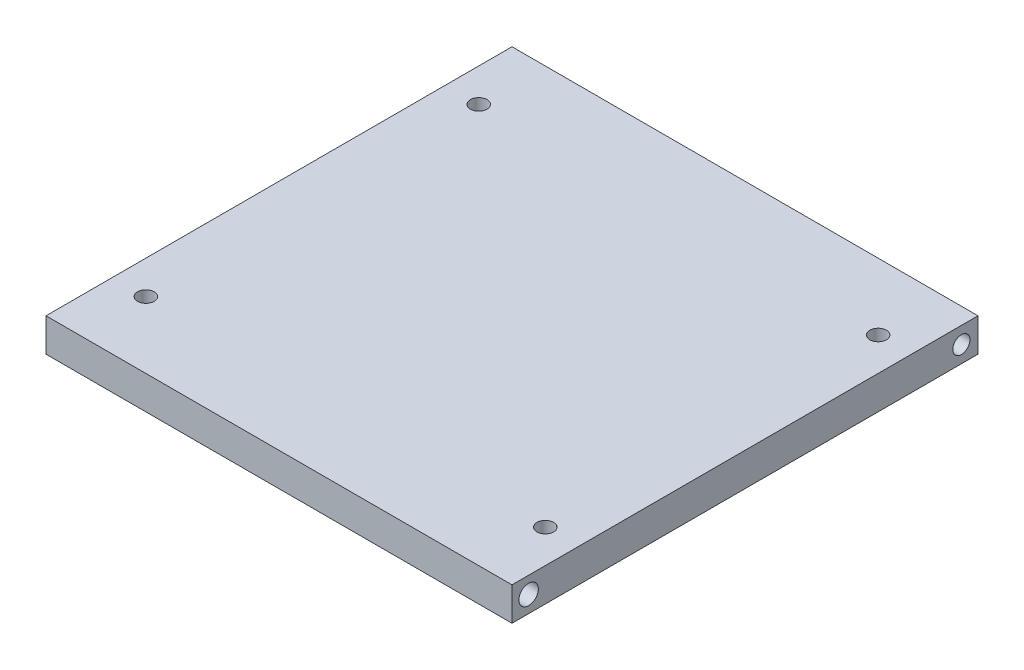
ISO-10303-21;
HEADER;
FILE_DESCRIPTION(('STEP AP214'),'2;1');
FILE_NAME('part.step','',(''),(''),'','','');
FILE_SCHEMA(('AUTOMOTIVE_DESIGN { 1 0 10303 214 1 1 1 1 }'));
ENDSEC;
DATA;
#1=APPLICATION_CONTEXT('core data for automotive mechanical design processes');
#2=APPLICATION_PROTOCOL_DEFINITION('international standard','automotive_design',2000,#1);
#3=PRODUCT_CONTEXT('',#1,'mechanical');
#4=PRODUCT('Part','Part','',(#3));
#5=PRODUCT_RELATED_PRODUCT_CATEGORY('part','',(#4));
#6=PRODUCT_DEFINITION_FORMATION('','',#4);
#7=PRODUCT_DEFINITION_CONTEXT('part definition',#1,'design');
#8=PRODUCT_DEFINITION('design','',#6,#7);
#9=PRODUCT_DEFINITION_SHAPE('','',#8);
#10=(LENGTH_UNIT() NAMED_UNIT(*) SI_UNIT(.MILLI.,.METRE.));
#11=(NAMED_UNIT(*) PLANE_ANGLE_UNIT() SI_UNIT($,.RADIAN.));
#12=(NAMED_UNIT(*) SI_UNIT($,.STERADIAN.) SOLID_ANGLE_UNIT());
#13=UNCERTAINTY_MEASURE_WITH_UNIT(LENGTH_MEASURE(1.E-05),#10,'distance_accuracy_value','');
#14=(GEOMETRIC_REPRESENTATION_CONTEXT(3) GLOBAL_UNCERTAINTY_ASSIGNED_CONTEXT((#13)) GLOBAL_UNIT_ASSIGNED_CONTEXT((#10,
#11,#12)) REPRESENTATION_CONTEXT('',''));
#15=CARTESIAN_POINT('',(0.,0.,0.));
#16=DIRECTION('',(0.,0.,1.));
#17=DIRECTION('',(1.,0.,0.));
#18=AXIS2_PLACEMENT_3D('',#15,#16,#17);
#19=CARTESIAN_POINT('',(78.,0.,-12.));
#20=DIRECTION('',(0.,1.,0.));
#21=DIRECTION('',(0.,0.,1.));
#22=AXIS2_PLACEMENT_3D('',#19,#20,#21);
#23=CYLINDRICAL_SURFACE('',#22,1.5);
#24=CARTESIAN_POINT('',(78.,0.,-12.));
#25=DIRECTION('',(0.,1.,0.));
#26=DIRECTION('',(0.,0.,1.));
#27=AXIS2_PLACEMENT_3D('',#24,#25,#26);
#28=CIRCLE('',#27,1.5);
#29=CARTESIAN_POINT('',(78.,0.,-10.5));
#30=VERTEX_POINT('',#29);
#31=EDGE_CURVE('E41',#30,#30,#28,.T.);
#32=ORIENTED_EDGE('',*,*,#31,.F.);
#33=EDGE_LOOP('',(#32));
#34=FACE_BOUND('',#33,.T.);
#35=CARTESIAN_POINT('',(78.,6.,-12.));
#36=DIRECTION('',(0.,1.,0.));
#37=DIRECTION('',(0.,0.,1.));
#38=AXIS2_PLACEMENT_3D('',#35,#36,#37);
#39=CIRCLE('',#38,1.5);
#40=CARTESIAN_POINT('',(78.,6.,-10.5));
#41=VERTEX_POINT('',#40);
#42=EDGE_CURVE('E11',#41,#41,#39,.T.);
#43=ORIENTED_EDGE('',*,*,#42,.T.);
#44=EDGE_LOOP('',(#43));
#45=FACE_BOUND('',#44,.T.);
#46=ADVANCED_FACE('F33',(#34,#45),#23,.F.);
#47=CARTESIAN_POINT('',(6.00000000000001,0.,-12.));
#48=DIRECTION('',(0.,1.,0.));
#49=DIRECTION('',(0.,0.,1.));
#50=AXIS2_PLACEMENT_3D('',#47,#48,#49);
#51=CYLINDRICAL_SURFACE('',#50,1.5);
#52=CARTESIAN_POINT('',(6.00000000000001,0.,-12.));
#53=DIRECTION('',(0.,1.,0.));
#54=DIRECTION('',(0.,0.,1.));
#55=AXIS2_PLACEMENT_3D('',#52,#53,#54);
#56=CIRCLE('',#55,1.5);
#57=CARTESIAN_POINT('',(6.00000000000001,0.,-10.5));
#58=VERTEX_POINT('',#57);
#59=EDGE_CURVE('E111',#58,#58,#56,.T.);
#60=ORIENTED_EDGE('',*,*,#59,.F.);
#61=EDGE_LOOP('',(#60));
#62=FACE_BOUND('',#61,.T.);
#63=CARTESIAN_POINT('',(6.00000000000001,6.,-12.));
#64=DIRECTION('',(0.,1.,0.));
#65=DIRECTION('',(0.,0.,1.));
#66=AXIS2_PLACEMENT_3D('',#63,#64,#65);
#67=CIRCLE('',#66,1.5);
#68=CARTESIAN_POINT('',(6.00000000000001,6.,-10.5));
#69=VERTEX_POINT('',#68);
#70=EDGE_CURVE('E114',#69,#69,#67,.T.);
#71=ORIENTED_EDGE('',*,*,#70,.T.);
#72=EDGE_LOOP('',(#71));
#73=FACE_BOUND('',#72,.T.);
#74=ADVANCED_FACE('F123',(#62,#73),#51,.F.);
#75=CARTESIAN_POINT('',(0.,6.,0.));
#76=DIRECTION('',(1.,0.,0.));
#77=DIRECTION('',(0.,0.,-1.));
#78=AXIS2_PLACEMENT_3D('',#75,#76,#77);
#79=PLANE('',#78);
#80=CARTESIAN_POINT('',(0.,3.,-81.));
#81=DIRECTION('',(-1.,0.,0.));
#82=DIRECTION('',(0.,0.,1.));
#83=AXIS2_PLACEMENT_3D('',#80,#81,#82);
#84=CIRCLE('',#83,1.54990424729698);
#85=CARTESIAN_POINT('',(0.,3.,-79.450095752703));
#86=VERTEX_POINT('',#85);
#87=EDGE_CURVE('E309',#86,#86,#84,.T.);
#88=ORIENTED_EDGE('',*,*,#87,.F.);
#89=EDGE_LOOP('',(#88));
#90=FACE_BOUND('',#89,.T.);
#91=CARTESIAN_POINT('',(0.,3.,-3.));
#92=DIRECTION('',(-1.,0.,0.));
#93=DIRECTION('',(0.,0.,1.));
#94=AXIS2_PLACEMENT_3D('',#91,#92,#93);
#95=CIRCLE('',#94,1.74824436285441);
#96=CARTESIAN_POINT('',(0.,3.,-1.25175563714559));
#97=VERTEX_POINT('',#96);
#98=EDGE_CURVE('E290',#97,#97,#95,.T.);
#99=ORIENTED_EDGE('',*,*,#98,.F.);
#100=EDGE_LOOP('',(#99));
#101=FACE_BOUND('',#100,.T.);
#102=DIRECTION('',(0.,0.,1.));
#103=VECTOR('',#102,1.);
#104=CARTESIAN_POINT('',(0.,0.,0.));
#105=LINE('',#104,#103);
#106=CARTESIAN_POINT('',(0.,0.,-84.));
#107=VERTEX_POINT('',#106);
#108=CARTESIAN_POINT('',(0.,0.,0.));
#109=VERTEX_POINT('',#108);
#110=EDGE_CURVE('E101',#107,#109,#105,.T.);
#111=ORIENTED_EDGE('',*,*,#110,.T.);
#112=DIRECTION('',(0.,-1.,0.));
#113=VECTOR('',#112,1.);
#114=CARTESIAN_POINT('',(0.,6.,0.));
#115=LINE('',#114,#113);
#116=CARTESIAN_POINT('',(0.,6.,0.));
#117=VERTEX_POINT('',#116);
#118=EDGE_CURVE('E92',#117,#109,#115,.T.);
#119=ORIENTED_EDGE('',*,*,#118,.F.);
#120=DIRECTION('',(0.,0.,1.));
#121=VECTOR('',#120,1.);
#122=CARTESIAN_POINT('',(0.,6.,0.));
#123=LINE('',#122,#121);
#124=CARTESIAN_POINT('',(0.,6.,-84.));
#125=VERTEX_POINT('',#124);
#126=EDGE_CURVE('E86',#125,#117,#123,.T.);
#127=ORIENTED_EDGE('',*,*,#126,.F.);
#128=DIRECTION('',(0.,-1.,0.));
#129=VECTOR('',#128,1.);
#130=CARTESIAN_POINT('',(0.,6.,-84.));
#131=LINE('',#130,#129);
#132=EDGE_CURVE('E97',#125,#107,#131,.T.);
#133=ORIENTED_EDGE('',*,*,#132,.T.);
#134=EDGE_LOOP('',(#111,#119,#127,#133));
#135=FACE_BOUND('',#134,.T.);
#136=ADVANCED_FACE('F148',(#90,#101,#135),#79,.F.);
#137=CARTESIAN_POINT('',(0.,6.,0.));
#138=DIRECTION('',(0.,0.,-1.));
#139=DIRECTION('',(-1.,0.,0.));
#140=AXIS2_PLACEMENT_3D('',#137,#138,#139);
#141=PLANE('',#140);
#142=DIRECTION('',(1.,0.,0.));
#143=VECTOR('',#142,1.);
#144=CARTESIAN_POINT('',(0.,0.,0.));
#145=LINE('',#144,#143);
#146=CARTESIAN_POINT('',(84.,0.,0.));
#147=VERTEX_POINT('',#146);
#148=EDGE_CURVE('E91',#109,#147,#145,.T.);
#149=ORIENTED_EDGE('',*,*,#148,.T.);
#150=DIRECTION('',(0.,-1.,0.));
#151=VECTOR('',#150,1.);
#152=CARTESIAN_POINT('',(84.,6.,0.));
#153=LINE('',#152,#151);
#154=CARTESIAN_POINT('',(84.,6.,0.));
#155=VERTEX_POINT('',#154);
#156=EDGE_CURVE('E89',#155,#147,#153,.T.);
#157=ORIENTED_EDGE('',*,*,#156,.F.);
#158=DIRECTION('',(1.,0.,0.));
#159=VECTOR('',#158,1.);
#160=CARTESIAN_POINT('',(0.,6.,0.));
#161=LINE('',#160,#159);
#162=EDGE_CURVE('E80',#117,#155,#161,.T.);
#163=ORIENTED_EDGE('',*,*,#162,.F.);
#164=ORIENTED_EDGE('',*,*,#118,.T.);
#165=EDGE_LOOP('',(#149,#157,#163,#164));
#166=FACE_BOUND('',#165,.T.);
#167=ADVANCED_FACE('F90',(#166),#141,.F.);
#168=CARTESIAN_POINT('',(84.,6.,0.));
#169=DIRECTION('',(-1.,0.,0.));
#170=DIRECTION('',(0.,0.,1.));
#171=AXIS2_PLACEMENT_3D('',#168,#169,#170);
#172=PLANE('',#171);
#173=CARTESIAN_POINT('',(84.,3.,-81.));
#174=DIRECTION('',(-1.,0.,0.));
#175=DIRECTION('',(0.,0.,1.));
#176=AXIS2_PLACEMENT_3D('',#173,#174,#175);
#177=CIRCLE('',#176,1.54990424729698);
#178=CARTESIAN_POINT('',(84.,3.,-79.450095752703));
#179=VERTEX_POINT('',#178);
#180=EDGE_CURVE('E291',#179,#179,#177,.T.);
#181=ORIENTED_EDGE('',*,*,#180,.T.);
#182=EDGE_LOOP('',(#181));
#183=FACE_BOUND('',#182,.T.);
#184=CARTESIAN_POINT('',(84.,3.,-3.));
#185=DIRECTION('',(-1.,0.,0.));
#186=DIRECTION('',(0.,0.,1.));
#187=AXIS2_PLACEMENT_3D('',#184,#185,#186);
#188=CIRCLE('',#187,1.74824436285441);
#189=CARTESIAN_POINT('',(84.,3.,-1.25175563714559));
#190=VERTEX_POINT('',#189);
#191=EDGE_CURVE('E302',#190,#190,#188,.T.);
#192=ORIENTED_EDGE('',*,*,#191,.T.);
#193=EDGE_LOOP('',(#192));
#194=FACE_BOUND('',#193,.T.);
#195=DIRECTION('',(0.,0.,-1.));
#196=VECTOR('',#195,1.);
#197=CARTESIAN_POINT('',(84.,0.,0.));
#198=LINE('',#197,#196);
#199=CARTESIAN_POINT('',(84.,0.,-84.));
#200=VERTEX_POINT('',#199);
#201=EDGE_CURVE('E66',#147,#200,#198,.T.);
#202=ORIENTED_EDGE('',*,*,#201,.T.);
#203=DIRECTION('',(0.,-1.,0.));
#204=VECTOR('',#203,1.);
#205=CARTESIAN_POINT('',(84.,6.,-84.));
#206=LINE('',#205,#204);
#207=CARTESIAN_POINT('',(84.,6.,-84.));
#208=VERTEX_POINT('',#207);
#209=EDGE_CURVE('E93',#208,#200,#206,.T.);
#210=ORIENTED_EDGE('',*,*,#209,.F.);
#211=DIRECTION('',(0.,0.,-1.));
#212=VECTOR('',#211,1.);
#213=CARTESIAN_POINT('',(84.,6.,0.));
#214=LINE('',#213,#212);
#215=EDGE_CURVE('E84',#155,#208,#214,.T.);
#216=ORIENTED_EDGE('',*,*,#215,.F.);
#217=ORIENTED_EDGE('',*,*,#156,.T.);
#218=EDGE_LOOP('',(#202,#210,#216,#217));
#219=FACE_BOUND('',#218,.T.);
#220=ADVANCED_FACE('F95',(#183,#194,#219),#172,.F.);
#221=CARTESIAN_POINT('',(0.,6.,-84.));
#222=DIRECTION('',(0.,0.,1.));
#223=DIRECTION('',(1.,0.,0.));
#224=AXIS2_PLACEMENT_3D('',#221,#222,#223);
#225=PLANE('',#224);
#226=DIRECTION('',(-1.,0.,0.));
#227=VECTOR('',#226,1.);
#228=CARTESIAN_POINT('',(0.,0.,-84.));
#229=LINE('',#228,#227);
#230=EDGE_CURVE('E72',#200,#107,#229,.T.);
#231=ORIENTED_EDGE('',*,*,#230,.T.);
#232=ORIENTED_EDGE('',*,*,#132,.F.);
#233=DIRECTION('',(-1.,0.,0.));
#234=VECTOR('',#233,1.);
#235=CARTESIAN_POINT('',(0.,6.,-84.));
#236=LINE('',#235,#234);
#237=EDGE_CURVE('E49',#208,#125,#236,.T.);
#238=ORIENTED_EDGE('',*,*,#237,.F.);
#239=ORIENTED_EDGE('',*,*,#209,.T.);
#240=EDGE_LOOP('',(#231,#232,#238,#239));
#241=FACE_BOUND('',#240,.T.);
#242=ADVANCED_FACE('F127',(#241),#225,.F.);
#243=CARTESIAN_POINT('',(0.,6.,0.));
#244=DIRECTION('',(0.,-1.,0.));
#245=DIRECTION('',(0.,0.,-1.));
#246=AXIS2_PLACEMENT_3D('',#243,#244,#245);
#247=PLANE('',#246);
#248=CARTESIAN_POINT('',(78.,6.,-72.));
#249=DIRECTION('',(0.,1.,0.));
#250=DIRECTION('',(0.,0.,1.));
#251=AXIS2_PLACEMENT_3D('',#248,#249,#250);
#252=CIRCLE('',#251,1.5);
#253=CARTESIAN_POINT('',(78.,6.,-70.5));
#254=VERTEX_POINT('',#253);
#255=EDGE_CURVE('E316',#254,#254,#252,.T.);
#256=ORIENTED_EDGE('',*,*,#255,.F.);
#257=EDGE_LOOP('',(#256));
#258=FACE_BOUND('',#257,.T.);
#259=CARTESIAN_POINT('',(6.,6.,-72.));
#260=DIRECTION('',(0.,1.,0.));
#261=DIRECTION('',(0.,0.,1.));
#262=AXIS2_PLACEMENT_3D('',#259,#260,#261);
#263=CIRCLE('',#262,1.5);
#264=CARTESIAN_POINT('',(6.,6.,-70.5));
#265=VERTEX_POINT('',#264);
#266=EDGE_CURVE('E319',#265,#265,#263,.T.);
#267=ORIENTED_EDGE('',*,*,#266,.F.);
#268=EDGE_LOOP('',(#267));
#269=FACE_BOUND('',#268,.T.);
#270=ORIENTED_EDGE('',*,*,#126,.T.);
#271=ORIENTED_EDGE('',*,*,#162,.T.);
#272=ORIENTED_EDGE('',*,*,#215,.T.);
#273=ORIENTED_EDGE('',*,*,#237,.T.);
#274=EDGE_LOOP('',(#270,#271,#272,#273));
#275=FACE_BOUND('',#274,.T.);
#276=ORIENTED_EDGE('',*,*,#70,.F.);
#277=EDGE_LOOP('',(#276));
#278=FACE_BOUND('',#277,.T.);
#279=ORIENTED_EDGE('',*,*,#42,.F.);
#280=EDGE_LOOP('',(#279));
#281=FACE_BOUND('',#280,.T.);
#282=ADVANCED_FACE('F81',(#258,#269,#275,#278,#281),#247,.F.);
#283=CARTESIAN_POINT('',(0.,0.,0.));
#284=DIRECTION('',(0.,-1.,0.));
#285=DIRECTION('',(0.,0.,-1.));
#286=AXIS2_PLACEMENT_3D('',#283,#284,#285);
#287=PLANE('',#286);
#288=CARTESIAN_POINT('',(78.,0.,-72.));
#289=DIRECTION('',(0.,1.,0.));
#290=DIRECTION('',(0.,0.,1.));
#291=AXIS2_PLACEMENT_3D('',#288,#289,#290);
#292=CIRCLE('',#291,1.5);
#293=CARTESIAN_POINT('',(78.,0.,-70.5));
#294=VERTEX_POINT('',#293);
#295=EDGE_CURVE('E308',#294,#294,#292,.T.);
#296=ORIENTED_EDGE('',*,*,#295,.T.);
#297=EDGE_LOOP('',(#296));
#298=FACE_BOUND('',#297,.T.);
#299=CARTESIAN_POINT('',(6.,0.,-72.));
#300=DIRECTION('',(0.,1.,0.));
#301=DIRECTION('',(0.,0.,1.));
#302=AXIS2_PLACEMENT_3D('',#299,#300,#301);
#303=CIRCLE('',#302,1.5);
#304=CARTESIAN_POINT('',(6.,0.,-70.5));
#305=VERTEX_POINT('',#304);
#306=EDGE_CURVE('E104',#305,#305,#303,.T.);
#307=ORIENTED_EDGE('',*,*,#306,.T.);
#308=EDGE_LOOP('',(#307));
#309=FACE_BOUND('',#308,.T.);
#310=ORIENTED_EDGE('',*,*,#110,.F.);
#311=ORIENTED_EDGE('',*,*,#230,.F.);
#312=ORIENTED_EDGE('',*,*,#201,.F.);
#313=ORIENTED_EDGE('',*,*,#148,.F.);
#314=EDGE_LOOP('',(#310,#311,#312,#313));
#315=FACE_BOUND('',#314,.T.);
#316=ORIENTED_EDGE('',*,*,#59,.T.);
#317=EDGE_LOOP('',(#316));
#318=FACE_BOUND('',#317,.T.);
#319=ORIENTED_EDGE('',*,*,#31,.T.);
#320=EDGE_LOOP('',(#319));
#321=FACE_BOUND('',#320,.T.);
#322=ADVANCED_FACE('F119',(#298,#309,#315,#318,#321),#287,.T.);
#323=CARTESIAN_POINT('',(6.,0.,-72.));
#324=DIRECTION('',(0.,1.,0.));
#325=DIRECTION('',(0.,0.,1.));
#326=AXIS2_PLACEMENT_3D('',#323,#324,#325);
#327=CYLINDRICAL_SURFACE('',#326,1.5);
#328=ORIENTED_EDGE('',*,*,#306,.F.);
#329=EDGE_LOOP('',(#328));
#330=FACE_BOUND('',#329,.T.);
#331=ORIENTED_EDGE('',*,*,#266,.T.);
#332=EDGE_LOOP('',(#331));
#333=FACE_BOUND('',#332,.T.);
#334=ADVANCED_FACE('F134',(#330,#333),#327,.F.);
#335=CARTESIAN_POINT('',(78.,0.,-72.));
#336=DIRECTION('',(0.,1.,0.));
#337=DIRECTION('',(0.,0.,1.));
#338=AXIS2_PLACEMENT_3D('',#335,#336,#337);
#339=CYLINDRICAL_SURFACE('',#338,1.5);
#340=ORIENTED_EDGE('',*,*,#295,.F.);
#341=EDGE_LOOP('',(#340));
#342=FACE_BOUND('',#341,.T.);
#343=ORIENTED_EDGE('',*,*,#255,.T.);
#344=EDGE_LOOP('',(#343));
#345=FACE_BOUND('',#344,.T.);
#346=ADVANCED_FACE('F190',(#342,#345),#339,.F.);
#347=CARTESIAN_POINT('',(10.,3.,-3.));
#348=DIRECTION('',(-1.,0.,0.));
#349=DIRECTION('',(0.,0.,1.));
#350=AXIS2_PLACEMENT_3D('',#347,#348,#349);
#351=CYLINDRICAL_SURFACE('',#350,1.74824436285441);
#352=CARTESIAN_POINT('',(10.,3.,-3.));
#353=DIRECTION('',(-1.,0.,0.));
#354=DIRECTION('',(0.,0.,1.));
#355=AXIS2_PLACEMENT_3D('',#352,#353,#354);
#356=CIRCLE('',#355,1.74824436285441);
#357=CARTESIAN_POINT('',(10.,3.,-1.25175563714559));
#358=VERTEX_POINT('',#357);
#359=EDGE_CURVE('E294',#358,#358,#356,.T.);
#360=ORIENTED_EDGE('',*,*,#359,.F.);
#361=EDGE_LOOP('',(#360));
#362=FACE_BOUND('',#361,.T.);
#363=ORIENTED_EDGE('',*,*,#98,.T.);
#364=EDGE_LOOP('',(#363));
#365=FACE_BOUND('',#364,.T.);
#366=ADVANCED_FACE('F207',(#362,#365),#351,.F.);
#367=CARTESIAN_POINT('',(10.,3.,-3.));
#368=DIRECTION('',(-1.,0.,0.));
#369=DIRECTION('',(0.,0.,1.));
#370=AXIS2_PLACEMENT_3D('',#367,#368,#369);
#371=PLANE('',#370);
#372=ORIENTED_EDGE('',*,*,#359,.T.);
#373=EDGE_LOOP('',(#372));
#374=FACE_BOUND('',#373,.T.);
#375=ADVANCED_FACE('F215',(#374),#371,.T.);
#376=CARTESIAN_POINT('',(10.,3.,-81.));
#377=DIRECTION('',(-1.,0.,0.));
#378=DIRECTION('',(0.,0.,1.));
#379=AXIS2_PLACEMENT_3D('',#376,#377,#378);
#380=CYLINDRICAL_SURFACE('',#379,1.54990424729698);
#381=CARTESIAN_POINT('',(10.,3.,-81.));
#382=DIRECTION('',(-1.,0.,0.));
#383=DIRECTION('',(0.,0.,1.));
#384=AXIS2_PLACEMENT_3D('',#381,#382,#383);
#385=CIRCLE('',#384,1.54990424729698);
#386=CARTESIAN_POINT('',(10.,3.,-79.450095752703));
#387=VERTEX_POINT('',#386);
#388=EDGE_CURVE('E305',#387,#387,#385,.T.);
#389=ORIENTED_EDGE('',*,*,#388,.F.);
#390=EDGE_LOOP('',(#389));
#391=FACE_BOUND('',#390,.T.);
#392=ORIENTED_EDGE('',*,*,#87,.T.);
#393=EDGE_LOOP('',(#392));
#394=FACE_BOUND('',#393,.T.);
#395=ADVANCED_FACE('F224',(#391,#394),#380,.F.);
#396=CARTESIAN_POINT('',(10.,3.,-81.));
#397=DIRECTION('',(-1.,0.,0.));
#398=DIRECTION('',(0.,0.,1.));
#399=AXIS2_PLACEMENT_3D('',#396,#397,#398);
#400=PLANE('',#399);
#401=ORIENTED_EDGE('',*,*,#388,.T.);
#402=EDGE_LOOP('',(#401));
#403=FACE_BOUND('',#402,.T.);
#404=ADVANCED_FACE('F233',(#403),#400,.T.);
#405=CARTESIAN_POINT('',(74.,3.,-3.));
#406=DIRECTION('',(1.,0.,0.));
#407=DIRECTION('',(0.,0.,-1.));
#408=AXIS2_PLACEMENT_3D('',#405,#406,#407);
#409=CYLINDRICAL_SURFACE('',#408,1.74824436285441);
#410=CARTESIAN_POINT('',(74.,3.,-3.));
#411=DIRECTION('',(-1.,0.,0.));
#412=DIRECTION('',(0.,0.,1.));
#413=AXIS2_PLACEMENT_3D('',#410,#411,#412);
#414=CIRCLE('',#413,1.74824436285441);
#415=CARTESIAN_POINT('',(74.,3.,-1.25175563714559));
#416=VERTEX_POINT('',#415);
#417=EDGE_CURVE('E297',#416,#416,#414,.T.);
#418=ORIENTED_EDGE('',*,*,#417,.T.);
#419=EDGE_LOOP('',(#418));
#420=FACE_BOUND('',#419,.T.);
#421=ORIENTED_EDGE('',*,*,#191,.F.);
#422=EDGE_LOOP('',(#421));
#423=FACE_BOUND('',#422,.T.);
#424=ADVANCED_FACE('F241',(#420,#423),#409,.F.);
#425=CARTESIAN_POINT('',(74.,3.,-3.));
#426=DIRECTION('',(1.,0.,0.));
#427=DIRECTION('',(0.,0.,1.));
#428=AXIS2_PLACEMENT_3D('',#425,#426,#427);
#429=PLANE('',#428);
#430=ORIENTED_EDGE('',*,*,#417,.F.);
#431=EDGE_LOOP('',(#430));
#432=FACE_BOUND('',#431,.T.);
#433=ADVANCED_FACE('F249',(#432),#429,.T.);
#434=CARTESIAN_POINT('',(74.,3.,-81.));
#435=DIRECTION('',(1.,0.,0.));
#436=DIRECTION('',(0.,0.,-1.));
#437=AXIS2_PLACEMENT_3D('',#434,#435,#436);
#438=CYLINDRICAL_SURFACE('',#437,1.54990424729698);
#439=CARTESIAN_POINT('',(74.,3.,-81.));
#440=DIRECTION('',(-1.,0.,0.));
#441=DIRECTION('',(0.,0.,1.));
#442=AXIS2_PLACEMENT_3D('',#439,#440,#441);
#443=CIRCLE('',#442,1.54990424729698);
#444=CARTESIAN_POINT('',(74.,3.,-79.450095752703));
#445=VERTEX_POINT('',#444);
#446=EDGE_CURVE('E289',#445,#445,#443,.T.);
#447=ORIENTED_EDGE('',*,*,#446,.T.);
#448=EDGE_LOOP('',(#447));
#449=FACE_BOUND('',#448,.T.);
#450=ORIENTED_EDGE('',*,*,#180,.F.);
#451=EDGE_LOOP('',(#450));
#452=FACE_BOUND('',#451,.T.);
#453=ADVANCED_FACE('F258',(#449,#452),#438,.F.);
#454=CARTESIAN_POINT('',(74.,3.,-81.));
#455=DIRECTION('',(1.,0.,0.));
#456=DIRECTION('',(0.,0.,1.));
#457=AXIS2_PLACEMENT_3D('',#454,#455,#456);
#458=PLANE('',#457);
#459=ORIENTED_EDGE('',*,*,#446,.F.);
#460=EDGE_LOOP('',(#459));
#461=FACE_BOUND('',#460,.T.);
#462=ADVANCED_FACE('F267',(#461),#458,.T.);
#463=CLOSED_SHELL('',(#46,#74,#136,#167,#220,#242,#282,#322,#334,#346,#366,#375,#395,#404,#424,
#433,#453,#462));
#464=MANIFOLD_SOLID_BREP('B2',#463);
#465=ADVANCED_BREP_SHAPE_REPRESENTATION('',(#18,#464),#14);
#466=SHAPE_DEFINITION_REPRESENTATION(#9,#465);
ENDSEC;
END-ISO-10303-21;
